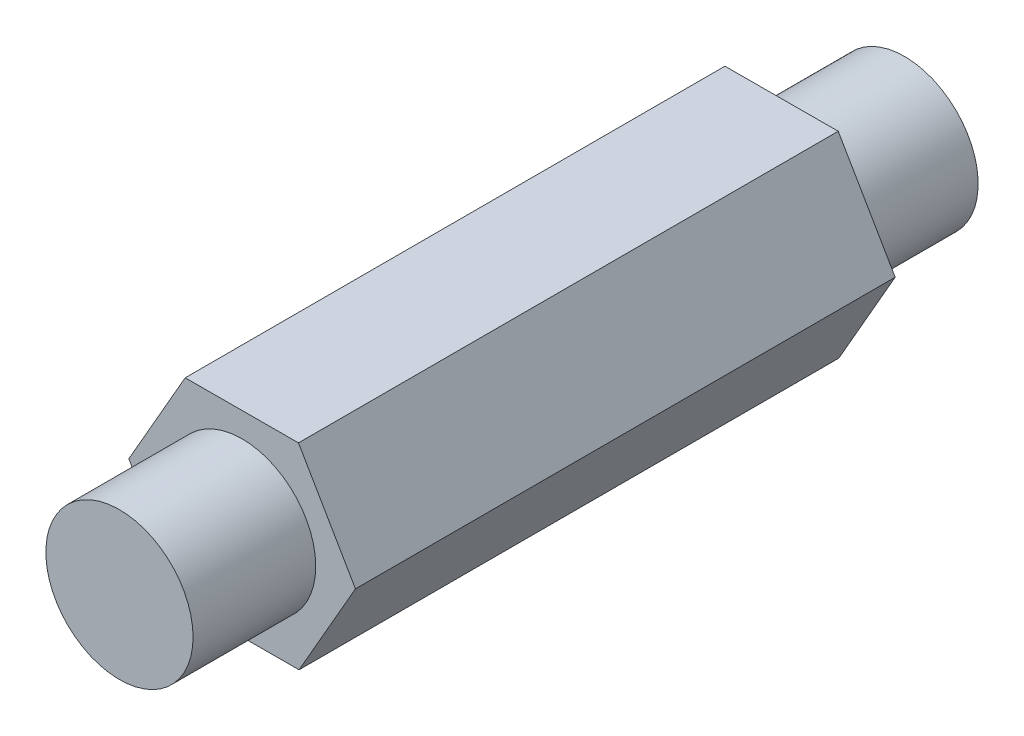
ISO-10303-21;
HEADER;
FILE_DESCRIPTION(('STEP AP214'),'2;1');
FILE_NAME('part.step','',(''),(''),'','','');
FILE_SCHEMA(('AUTOMOTIVE_DESIGN { 1 0 10303 214 1 1 1 1 }'));
ENDSEC;
DATA;
#1=APPLICATION_CONTEXT('core data for automotive mechanical design processes');
#2=APPLICATION_PROTOCOL_DEFINITION('international standard','automotive_design',2000,#1);
#3=PRODUCT_CONTEXT('',#1,'mechanical');
#4=PRODUCT('Part','Part','',(#3));
#5=PRODUCT_RELATED_PRODUCT_CATEGORY('part','',(#4));
#6=PRODUCT_DEFINITION_FORMATION('','',#4);
#7=PRODUCT_DEFINITION_CONTEXT('part definition',#1,'design');
#8=PRODUCT_DEFINITION('design','',#6,#7);
#9=PRODUCT_DEFINITION_SHAPE('','',#8);
#10=(LENGTH_UNIT() NAMED_UNIT(*) SI_UNIT(.MILLI.,.METRE.));
#11=(NAMED_UNIT(*) PLANE_ANGLE_UNIT() SI_UNIT($,.RADIAN.));
#12=(NAMED_UNIT(*) SI_UNIT($,.STERADIAN.) SOLID_ANGLE_UNIT());
#13=UNCERTAINTY_MEASURE_WITH_UNIT(LENGTH_MEASURE(1.E-05),#10,'distance_accuracy_value','');
#14=(GEOMETRIC_REPRESENTATION_CONTEXT(3) GLOBAL_UNCERTAINTY_ASSIGNED_CONTEXT((#13)) GLOBAL_UNIT_ASSIGNED_CONTEXT((#10,
#11,#12)) REPRESENTATION_CONTEXT('',''));
#15=CARTESIAN_POINT('',(0.,0.,0.));
#16=DIRECTION('',(0.,0.,1.));
#17=DIRECTION('',(1.,0.,0.));
#18=AXIS2_PLACEMENT_3D('',#15,#16,#17);
#19=CARTESIAN_POINT('',(-3.64772793712828,-6.3606142965933,25.4));
#20=DIRECTION('',(-0.00290249282140695,0.999995787758839,0.));
#21=DIRECTION('',(-0.999995787758839,-0.00290249282140695,0.));
#22=AXIS2_PLACEMENT_3D('',#19,#20,#21);
#23=PLANE('',#22);
#24=DIRECTION('',(-0.999995787758839,-0.00290249282140695,0.));
#25=VECTOR('',#24,1.);
#26=CARTESIAN_POINT('',(-3.64772793712828,-6.3606142965933,-17.4625));
#27=LINE('',#26,#25);
#28=CARTESIAN_POINT('',(3.68458959596015,-6.33933220794395,-17.4625));
#29=VERTEX_POINT('',#28);
#30=CARTESIAN_POINT('',(-3.64772793712828,-6.3606142965933,-17.4625));
#31=VERTEX_POINT('',#30);
#32=EDGE_CURVE('E47',#29,#31,#27,.T.);
#33=ORIENTED_EDGE('',*,*,#32,.F.);
#34=DIRECTION('',(0.,0.,-1.));
#35=VECTOR('',#34,1.);
#36=CARTESIAN_POINT('',(3.68458959596015,-6.33933220794395,25.4));
#37=LINE('',#36,#35);
#38=CARTESIAN_POINT('',(3.68458959596015,-6.33933220794396,17.4625));
#39=VERTEX_POINT('',#38);
#40=EDGE_CURVE('E115',#39,#29,#37,.T.);
#41=ORIENTED_EDGE('',*,*,#40,.F.);
#42=DIRECTION('',(0.999995787758839,0.00290249282140695,0.));
#43=VECTOR('',#42,1.);
#44=CARTESIAN_POINT('',(-3.64772793712828,-6.3606142965933,17.4625));
#45=LINE('',#44,#43);
#46=CARTESIAN_POINT('',(-3.64772793712828,-6.36061429659331,17.4625));
#47=VERTEX_POINT('',#46);
#48=EDGE_CURVE('E119',#47,#39,#45,.T.);
#49=ORIENTED_EDGE('',*,*,#48,.F.);
#50=DIRECTION('',(0.,0.,-1.));
#51=VECTOR('',#50,1.);
#52=CARTESIAN_POINT('',(-3.64772793712828,-6.3606142965933,25.4));
#53=LINE('',#52,#51);
#54=EDGE_CURVE('E109',#47,#31,#53,.T.);
#55=ORIENTED_EDGE('',*,*,#54,.T.);
#56=EDGE_LOOP('',(#33,#41,#49,#55));
#57=FACE_BOUND('',#56,.T.);
#58=ADVANCED_FACE('F34',(#57),#23,.F.);
#59=CARTESIAN_POINT('',(3.68458959596015,-6.33933220794395,25.4));
#60=DIRECTION('',(-0.86747300228729,0.497484261361779,0.));
#61=DIRECTION('',(-0.497484261361779,-0.86747300228729,0.));
#62=AXIS2_PLACEMENT_3D('',#59,#60,#61);
#63=PLANE('',#62);
#64=DIRECTION('',(-0.497484261361779,-0.86747300228729,0.));
#65=VECTOR('',#64,1.);
#66=CARTESIAN_POINT('',(3.68458959596015,-6.33933220794395,-17.4625));
#67=LINE('',#66,#65);
#68=CARTESIAN_POINT('',(7.33231753308843,0.0212820886493618,-17.4625));
#69=VERTEX_POINT('',#68);
#70=EDGE_CURVE('E143',#69,#29,#67,.T.);
#71=ORIENTED_EDGE('',*,*,#70,.F.);
#72=DIRECTION('',(0.,0.,-1.));
#73=VECTOR('',#72,1.);
#74=CARTESIAN_POINT('',(7.33231753308843,0.0212820886493565,25.4));
#75=LINE('',#74,#73);
#76=CARTESIAN_POINT('',(7.33231753308843,0.021282088649357,17.4625));
#77=VERTEX_POINT('',#76);
#78=EDGE_CURVE('E107',#77,#69,#75,.T.);
#79=ORIENTED_EDGE('',*,*,#78,.F.);
#80=DIRECTION('',(0.497484261361779,0.86747300228729,0.));
#81=VECTOR('',#80,1.);
#82=CARTESIAN_POINT('',(3.68458959596015,-6.33933220794395,17.4625));
#83=LINE('',#82,#81);
#84=EDGE_CURVE('E126',#39,#77,#83,.T.);
#85=ORIENTED_EDGE('',*,*,#84,.F.);
#86=ORIENTED_EDGE('',*,*,#40,.T.);
#87=EDGE_LOOP('',(#71,#79,#85,#86));
#88=FACE_BOUND('',#87,.T.);
#89=ADVANCED_FACE('F169',(#88),#63,.F.);
#90=CARTESIAN_POINT('',(7.33231753308843,0.0212820886493565,25.4));
#91=DIRECTION('',(-0.864570509465883,-0.50251152639706,0.));
#92=DIRECTION('',(0.50251152639706,-0.864570509465883,0.));
#93=AXIS2_PLACEMENT_3D('',#90,#91,#92);
#94=PLANE('',#93);
#95=DIRECTION('',(0.50251152639706,-0.864570509465883,0.));
#96=VECTOR('',#95,1.);
#97=CARTESIAN_POINT('',(7.33231753308843,0.0212820886493565,-17.4625));
#98=LINE('',#97,#96);
#99=CARTESIAN_POINT('',(3.64772793712828,6.36061429659331,-17.4625));
#100=VERTEX_POINT('',#99);
#101=EDGE_CURVE('E102',#100,#69,#98,.T.);
#102=ORIENTED_EDGE('',*,*,#101,.F.);
#103=DIRECTION('',(0.,0.,-1.));
#104=VECTOR('',#103,1.);
#105=CARTESIAN_POINT('',(3.64772793712828,6.36061429659331,25.4));
#106=LINE('',#105,#104);
#107=CARTESIAN_POINT('',(3.64772793712828,6.36061429659331,17.4625));
#108=VERTEX_POINT('',#107);
#109=EDGE_CURVE('E101',#108,#100,#106,.T.);
#110=ORIENTED_EDGE('',*,*,#109,.F.);
#111=DIRECTION('',(-0.50251152639706,0.864570509465883,0.));
#112=VECTOR('',#111,1.);
#113=CARTESIAN_POINT('',(7.33231753308843,0.0212820886493565,17.4625));
#114=LINE('',#113,#112);
#115=EDGE_CURVE('E131',#77,#108,#114,.T.);
#116=ORIENTED_EDGE('',*,*,#115,.F.);
#117=ORIENTED_EDGE('',*,*,#78,.T.);
#118=EDGE_LOOP('',(#102,#110,#116,#117));
#119=FACE_BOUND('',#118,.T.);
#120=ADVANCED_FACE('F173',(#119),#94,.F.);
#121=CARTESIAN_POINT('',(3.64772793712828,6.36061429659331,25.4));
#122=DIRECTION('',(0.00290249282140672,-0.999995787758839,0.));
#123=DIRECTION('',(0.999995787758839,0.00290249282140672,0.));
#124=AXIS2_PLACEMENT_3D('',#121,#122,#123);
#125=PLANE('',#124);
#126=DIRECTION('',(0.999995787758839,0.00290249282140672,0.));
#127=VECTOR('',#126,1.);
#128=CARTESIAN_POINT('',(3.64772793712828,6.36061429659331,-17.4625));
#129=LINE('',#128,#127);
#130=CARTESIAN_POINT('',(-3.68458959596015,6.33933220794395,-17.4625));
#131=VERTEX_POINT('',#130);
#132=EDGE_CURVE('E86',#131,#100,#129,.T.);
#133=ORIENTED_EDGE('',*,*,#132,.F.);
#134=DIRECTION('',(0.,0.,-1.));
#135=VECTOR('',#134,1.);
#136=CARTESIAN_POINT('',(-3.68458959596015,6.33933220794395,25.4));
#137=LINE('',#136,#135);
#138=CARTESIAN_POINT('',(-3.68458959596015,6.33933220794396,17.4625));
#139=VERTEX_POINT('',#138);
#140=EDGE_CURVE('E99',#139,#131,#137,.T.);
#141=ORIENTED_EDGE('',*,*,#140,.F.);
#142=DIRECTION('',(-0.999995787758839,-0.00290249282140672,0.));
#143=VECTOR('',#142,1.);
#144=CARTESIAN_POINT('',(3.64772793712828,6.36061429659331,17.4625));
#145=LINE('',#144,#143);
#146=EDGE_CURVE('E133',#108,#139,#145,.T.);
#147=ORIENTED_EDGE('',*,*,#146,.F.);
#148=ORIENTED_EDGE('',*,*,#109,.T.);
#149=EDGE_LOOP('',(#133,#141,#147,#148));
#150=FACE_BOUND('',#149,.T.);
#151=ADVANCED_FACE('F97',(#150),#125,.F.);
#152=CARTESIAN_POINT('',(-3.68458959596015,6.33933220794395,25.4));
#153=DIRECTION('',(0.86747300228729,-0.49748426136178,0.));
#154=DIRECTION('',(0.49748426136178,0.86747300228729,0.));
#155=AXIS2_PLACEMENT_3D('',#152,#153,#154);
#156=PLANE('',#155);
#157=DIRECTION('',(0.49748426136178,0.86747300228729,0.));
#158=VECTOR('',#157,1.);
#159=CARTESIAN_POINT('',(-3.68458959596015,6.33933220794395,-17.4625));
#160=LINE('',#159,#158);
#161=CARTESIAN_POINT('',(-7.33231753308843,-0.0212820886493557,-17.4625));
#162=VERTEX_POINT('',#161);
#163=EDGE_CURVE('E83',#162,#131,#160,.T.);
#164=ORIENTED_EDGE('',*,*,#163,.F.);
#165=DIRECTION('',(0.,0.,-1.));
#166=VECTOR('',#165,1.);
#167=CARTESIAN_POINT('',(-7.33231753308843,-0.0212820886493516,25.4));
#168=LINE('',#167,#166);
#169=CARTESIAN_POINT('',(-7.33231753308843,-0.0212820886493516,17.4625));
#170=VERTEX_POINT('',#169);
#171=EDGE_CURVE('E105',#170,#162,#168,.T.);
#172=ORIENTED_EDGE('',*,*,#171,.F.);
#173=DIRECTION('',(-0.49748426136178,-0.86747300228729,0.));
#174=VECTOR('',#173,1.);
#175=CARTESIAN_POINT('',(-3.68458959596015,6.33933220794395,17.4625));
#176=LINE('',#175,#174);
#177=EDGE_CURVE('E55',#139,#170,#176,.T.);
#178=ORIENTED_EDGE('',*,*,#177,.F.);
#179=ORIENTED_EDGE('',*,*,#140,.T.);
#180=EDGE_LOOP('',(#164,#172,#178,#179));
#181=FACE_BOUND('',#180,.T.);
#182=ADVANCED_FACE('F104',(#181),#156,.F.);
#183=CARTESIAN_POINT('',(-7.33231753308843,-0.0212820886493516,25.4));
#184=DIRECTION('',(0.864570509465883,0.50251152639706,0.));
#185=DIRECTION('',(-0.50251152639706,0.864570509465883,0.));
#186=AXIS2_PLACEMENT_3D('',#183,#184,#185);
#187=PLANE('',#186);
#188=DIRECTION('',(-0.50251152639706,0.864570509465883,0.));
#189=VECTOR('',#188,1.);
#190=CARTESIAN_POINT('',(-7.33231753308843,-0.0212820886493516,-17.4625));
#191=LINE('',#190,#189);
#192=EDGE_CURVE('E11',#31,#162,#191,.T.);
#193=ORIENTED_EDGE('',*,*,#192,.F.);
#194=ORIENTED_EDGE('',*,*,#54,.F.);
#195=DIRECTION('',(0.50251152639706,-0.864570509465883,0.));
#196=VECTOR('',#195,1.);
#197=CARTESIAN_POINT('',(-7.33231753308843,-0.0212820886493516,17.4625));
#198=LINE('',#197,#196);
#199=EDGE_CURVE('E41',#170,#47,#198,.T.);
#200=ORIENTED_EDGE('',*,*,#199,.F.);
#201=ORIENTED_EDGE('',*,*,#171,.T.);
#202=EDGE_LOOP('',(#193,#194,#200,#201));
#203=FACE_BOUND('',#202,.T.);
#204=ADVANCED_FACE('F128',(#203),#187,.F.);
#205=CARTESIAN_POINT('',(0.,0.,17.4625));
#206=DIRECTION('',(0.,0.,1.));
#207=DIRECTION('',(1.,0.,0.));
#208=AXIS2_PLACEMENT_3D('',#205,#206,#207);
#209=PLANE('',#208);
#210=CARTESIAN_POINT('',(0.,0.,17.4625));
#211=DIRECTION('',(0.,0.,1.));
#212=DIRECTION('',(1.,0.,0.));
#213=AXIS2_PLACEMENT_3D('',#210,#211,#212);
#214=CIRCLE('',#213,4.7625);
#215=CARTESIAN_POINT('',(4.7625,0.,17.4625));
#216=VERTEX_POINT('',#215);
#217=EDGE_CURVE('E136',#216,#216,#214,.T.);
#218=ORIENTED_EDGE('',*,*,#217,.F.);
#219=EDGE_LOOP('',(#218));
#220=FACE_BOUND('',#219,.T.);
#221=ORIENTED_EDGE('',*,*,#48,.T.);
#222=ORIENTED_EDGE('',*,*,#84,.T.);
#223=ORIENTED_EDGE('',*,*,#115,.T.);
#224=ORIENTED_EDGE('',*,*,#146,.T.);
#225=ORIENTED_EDGE('',*,*,#177,.T.);
#226=ORIENTED_EDGE('',*,*,#199,.T.);
#227=EDGE_LOOP('',(#221,#222,#223,#224,#225,#226));
#228=FACE_BOUND('',#227,.T.);
#229=ADVANCED_FACE('F118',(#220,#228),#209,.T.);
#230=CARTESIAN_POINT('',(0.,0.,17.4625));
#231=DIRECTION('',(0.,0.,1.));
#232=DIRECTION('',(1.,0.,0.));
#233=AXIS2_PLACEMENT_3D('',#230,#231,#232);
#234=CYLINDRICAL_SURFACE('',#233,4.7625);
#235=ORIENTED_EDGE('',*,*,#217,.T.);
#236=EDGE_LOOP('',(#235));
#237=FACE_BOUND('',#236,.T.);
#238=CARTESIAN_POINT('',(0.,0.,25.4));
#239=DIRECTION('',(0.,0.,1.));
#240=DIRECTION('',(1.,0.,0.));
#241=AXIS2_PLACEMENT_3D('',#238,#239,#240);
#242=CIRCLE('',#241,4.7625);
#243=CARTESIAN_POINT('',(4.7625,0.,25.4));
#244=VERTEX_POINT('',#243);
#245=EDGE_CURVE('E137',#244,#244,#242,.T.);
#246=ORIENTED_EDGE('',*,*,#245,.F.);
#247=EDGE_LOOP('',(#246));
#248=FACE_BOUND('',#247,.T.);
#249=ADVANCED_FACE('F164',(#237,#248),#234,.T.);
#250=CARTESIAN_POINT('',(0.,0.,25.4));
#251=DIRECTION('',(0.,0.,1.));
#252=DIRECTION('',(1.,0.,0.));
#253=AXIS2_PLACEMENT_3D('',#250,#251,#252);
#254=PLANE('',#253);
#255=ORIENTED_EDGE('',*,*,#245,.T.);
#256=EDGE_LOOP('',(#255));
#257=FACE_BOUND('',#256,.T.);
#258=ADVANCED_FACE('F156',(#257),#254,.T.);
#259=CARTESIAN_POINT('',(0.,0.,-17.4625));
#260=DIRECTION('',(0.,0.,-1.));
#261=DIRECTION('',(-1.,0.,0.));
#262=AXIS2_PLACEMENT_3D('',#259,#260,#261);
#263=PLANE('',#262);
#264=CARTESIAN_POINT('',(0.,0.,-17.4625));
#265=DIRECTION('',(0.,0.,-1.));
#266=DIRECTION('',(-1.,0.,0.));
#267=AXIS2_PLACEMENT_3D('',#264,#265,#266);
#268=CIRCLE('',#267,4.7625);
#269=CARTESIAN_POINT('',(-4.7625,0.,-17.4625));
#270=VERTEX_POINT('',#269);
#271=EDGE_CURVE('E92',#270,#270,#268,.T.);
#272=ORIENTED_EDGE('',*,*,#271,.F.);
#273=EDGE_LOOP('',(#272));
#274=FACE_BOUND('',#273,.T.);
#275=ORIENTED_EDGE('',*,*,#32,.T.);
#276=ORIENTED_EDGE('',*,*,#192,.T.);
#277=ORIENTED_EDGE('',*,*,#163,.T.);
#278=ORIENTED_EDGE('',*,*,#132,.T.);
#279=ORIENTED_EDGE('',*,*,#101,.T.);
#280=ORIENTED_EDGE('',*,*,#70,.T.);
#281=EDGE_LOOP('',(#275,#276,#277,#278,#279,#280));
#282=FACE_BOUND('',#281,.T.);
#283=ADVANCED_FACE('F85',(#274,#282),#263,.T.);
#284=CARTESIAN_POINT('',(0.,0.,-17.4625));
#285=DIRECTION('',(0.,0.,-1.));
#286=DIRECTION('',(-1.,0.,0.));
#287=AXIS2_PLACEMENT_3D('',#284,#285,#286);
#288=CYLINDRICAL_SURFACE('',#287,4.7625);
#289=ORIENTED_EDGE('',*,*,#271,.T.);
#290=EDGE_LOOP('',(#289));
#291=FACE_BOUND('',#290,.T.);
#292=CARTESIAN_POINT('',(0.,0.,-25.4));
#293=DIRECTION('',(0.,0.,-1.));
#294=DIRECTION('',(-1.,0.,0.));
#295=AXIS2_PLACEMENT_3D('',#292,#293,#294);
#296=CIRCLE('',#295,4.7625);
#297=CARTESIAN_POINT('',(-4.7625,0.,-25.4));
#298=VERTEX_POINT('',#297);
#299=EDGE_CURVE('E146',#298,#298,#296,.T.);
#300=ORIENTED_EDGE('',*,*,#299,.F.);
#301=EDGE_LOOP('',(#300));
#302=FACE_BOUND('',#301,.T.);
#303=ADVANCED_FACE('F152',(#291,#302),#288,.T.);
#304=CARTESIAN_POINT('',(0.,0.,-25.4));
#305=DIRECTION('',(0.,0.,1.));
#306=DIRECTION('',(1.,0.,0.));
#307=AXIS2_PLACEMENT_3D('',#304,#305,#306);
#308=PLANE('',#307);
#309=ORIENTED_EDGE('',*,*,#299,.T.);
#310=EDGE_LOOP('',(#309));
#311=FACE_BOUND('',#310,.T.);
#312=ADVANCED_FACE('F162',(#311),#308,.F.);
#313=CLOSED_SHELL('',(#58,#89,#120,#151,#182,#204,#229,#249,#258,#283,#303,#312));
#314=MANIFOLD_SOLID_BREP('B2',#313);
#315=ADVANCED_BREP_SHAPE_REPRESENTATION('',(#18,#314),#14);
#316=SHAPE_DEFINITION_REPRESENTATION(#9,#315);
ENDSEC;
END-ISO-10303-21;
